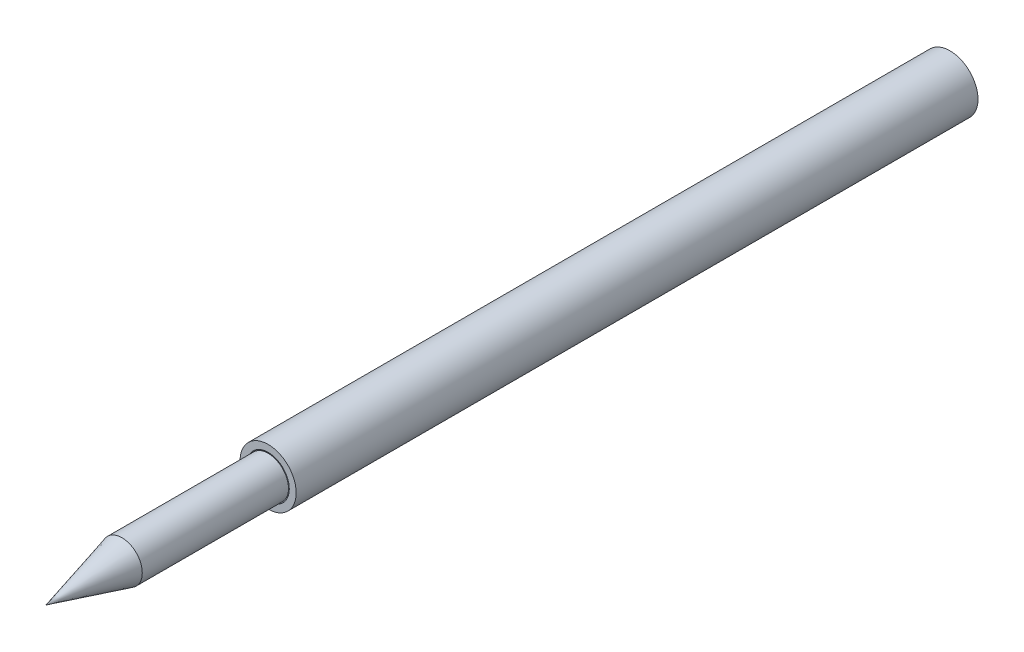
ISO-10303-21;
HEADER;
FILE_DESCRIPTION(('STEP AP214'),'2;1');
FILE_NAME('part.step','',(''),(''),'','','');
FILE_SCHEMA(('AUTOMOTIVE_DESIGN { 1 0 10303 214 1 1 1 1 }'));
ENDSEC;
DATA;
#1=APPLICATION_CONTEXT('core data for automotive mechanical design processes');
#2=APPLICATION_PROTOCOL_DEFINITION('international standard','automotive_design',2000,#1);
#3=PRODUCT_CONTEXT('',#1,'mechanical');
#4=PRODUCT('Part','Part','',(#3));
#5=PRODUCT_RELATED_PRODUCT_CATEGORY('part','',(#4));
#6=PRODUCT_DEFINITION_FORMATION('','',#4);
#7=PRODUCT_DEFINITION_CONTEXT('part definition',#1,'design');
#8=PRODUCT_DEFINITION('design','',#6,#7);
#9=PRODUCT_DEFINITION_SHAPE('','',#8);
#10=(LENGTH_UNIT() NAMED_UNIT(*) SI_UNIT(.MILLI.,.METRE.));
#11=(NAMED_UNIT(*) PLANE_ANGLE_UNIT() SI_UNIT($,.RADIAN.));
#12=(NAMED_UNIT(*) SI_UNIT($,.STERADIAN.) SOLID_ANGLE_UNIT());
#13=UNCERTAINTY_MEASURE_WITH_UNIT(LENGTH_MEASURE(1.E-05),#10,'distance_accuracy_value','');
#14=(GEOMETRIC_REPRESENTATION_CONTEXT(3) GLOBAL_UNCERTAINTY_ASSIGNED_CONTEXT((#13)) GLOBAL_UNIT_ASSIGNED_CONTEXT((#10,
#11,#12)) REPRESENTATION_CONTEXT('',''));
#15=CARTESIAN_POINT('',(0.,0.,0.));
#16=DIRECTION('',(0.,0.,1.));
#17=DIRECTION('',(1.,0.,0.));
#18=AXIS2_PLACEMENT_3D('',#15,#16,#17);
#19=CARTESIAN_POINT('',(-0.0292577713322146,0.,-15.0402853662058));
#20=DIRECTION('',(0.,-1.,0.));
#21=DIRECTION('',(1.,0.,0.));
#22=AXIS2_PLACEMENT_3D('',#19,#20,#21);
#23=CIRCLE('',#22,1.5);
#24=TRIMMED_CURVE('',#23,(PARAMETER_VALUE(-1.55128990889718)),
(PARAMETER_VALUE(1.55128990889718)),.T.,.PARAMETER.);
#25=CARTESIAN_POINT('',(0.,0.,-15.0402853662058));
#26=DIRECTION('',(0.,0.,1.));
#27=AXIS1_PLACEMENT('',#25,#26);
#28=SURFACE_OF_REVOLUTION('',#24,#27);
#29=CARTESIAN_POINT('',(0.,0.,-16.54));
#30=VERTEX_POINT('',#29);
#31=VERTEX_LOOP('',#30);
#32=FACE_BOUND('',#31,.T.);
#33=CARTESIAN_POINT('',(0.,0.,-16.44));
#34=DIRECTION('',(0.,0.,1.));
#35=DIRECTION('',(1.,0.,0.));
#36=AXIS2_PLACEMENT_3D('',#33,#34,#35);
#37=CIRCLE('',#36,0.51);
#38=CARTESIAN_POINT('',(0.51,0.,-16.44));
#39=VERTEX_POINT('',#38);
#40=EDGE_CURVE('P0_E26',#39,#39,#37,.T.);
#41=ORIENTED_EDGE('',*,*,#40,.F.);
#42=EDGE_LOOP('',(#41));
#43=FACE_BOUND('',#42,.T.);
#44=ADVANCED_FACE('P0_F17',(#32,#43),#28,.T.);
#45=CARTESIAN_POINT('',(0.,0.,0.));
#46=DIRECTION('',(0.,0.,1.));
#47=DIRECTION('',(1.,0.,0.));
#48=AXIS2_PLACEMENT_3D('',#45,#46,#47);
#49=CYLINDRICAL_SURFACE('',#48,0.51);
#50=ORIENTED_EDGE('',*,*,#40,.T.);
#51=EDGE_LOOP('',(#50));
#52=FACE_BOUND('',#51,.T.);
#53=CARTESIAN_POINT('',(0.,0.,-4.04));
#54=DIRECTION('',(0.,0.,1.));
#55=DIRECTION('',(1.,0.,0.));
#56=AXIS2_PLACEMENT_3D('',#53,#54,#55);
#57=CIRCLE('',#56,0.51);
#58=CARTESIAN_POINT('',(0.51,0.,-4.04));
#59=VERTEX_POINT('',#58);
#60=EDGE_CURVE('P0_E11',#59,#59,#57,.T.);
#61=ORIENTED_EDGE('',*,*,#60,.F.);
#62=EDGE_LOOP('',(#61));
#63=FACE_BOUND('',#62,.T.);
#64=ADVANCED_FACE('P0_F55',(#52,#63),#49,.T.);
#65=CARTESIAN_POINT('',(0.,0.,-4.04));
#66=DIRECTION('',(0.,0.,1.));
#67=DIRECTION('',(1.,0.,0.));
#68=AXIS2_PLACEMENT_3D('',#65,#66,#67);
#69=PLANE('',#68);
#70=CARTESIAN_POINT('',(0.,0.,-4.04));
#71=DIRECTION('',(0.,0.,1.));
#72=DIRECTION('',(1.,0.,0.));
#73=AXIS2_PLACEMENT_3D('',#70,#71,#72);
#74=CIRCLE('',#73,0.385);
#75=CARTESIAN_POINT('',(0.385,0.,-4.04));
#76=VERTEX_POINT('',#75);
#77=EDGE_CURVE('P0_E42',#76,#76,#74,.T.);
#78=ORIENTED_EDGE('',*,*,#77,.F.);
#79=EDGE_LOOP('',(#78));
#80=FACE_BOUND('',#79,.T.);
#81=ORIENTED_EDGE('',*,*,#60,.T.);
#82=EDGE_LOOP('',(#81));
#83=FACE_BOUND('',#82,.T.);
#84=ADVANCED_FACE('P0_F19',(#80,#83),#69,.T.);
#85=CARTESIAN_POINT('',(-0.0292577713322146,0.,-15.0402853662058));
#86=DIRECTION('',(0.,-1.,0.));
#87=DIRECTION('',(1.,0.,0.));
#88=AXIS2_PLACEMENT_3D('',#85,#86,#87);
#89=CIRCLE('',#88,1.375);
#90=TRIMMED_CURVE('',#89,(PARAMETER_VALUE(-1.54951634161706)),
(PARAMETER_VALUE(1.54951634161706)),.T.,.PARAMETER.);
#91=CARTESIAN_POINT('',(0.,0.,-15.0402853662058));
#92=DIRECTION('',(0.,0.,1.));
#93=AXIS1_PLACEMENT('',#91,#92);
#94=SURFACE_OF_REVOLUTION('',#90,#93);
#95=CARTESIAN_POINT('',(0.,0.,-16.4149740519876));
#96=VERTEX_POINT('',#95);
#97=VERTEX_LOOP('',#96);
#98=FACE_BOUND('',#97,.T.);
#99=CARTESIAN_POINT('',(0.,0.,-16.3513976798123));
#100=DIRECTION('',(0.,0.,1.));
#101=DIRECTION('',(1.,0.,0.));
#102=AXIS2_PLACEMENT_3D('',#99,#100,#101);
#103=CIRCLE('',#102,0.385);
#104=CARTESIAN_POINT('',(0.385,0.,-16.3513976798123));
#105=VERTEX_POINT('',#104);
#106=EDGE_CURVE('P0_E39',#105,#105,#103,.T.);
#107=ORIENTED_EDGE('',*,*,#106,.T.);
#108=EDGE_LOOP('',(#107));
#109=FACE_BOUND('',#108,.T.);
#110=ADVANCED_FACE('P0_F32',(#98,#109),#94,.F.);
#111=CARTESIAN_POINT('',(0.,0.,0.));
#112=DIRECTION('',(0.,0.,1.));
#113=DIRECTION('',(1.,0.,0.));
#114=AXIS2_PLACEMENT_3D('',#111,#112,#113);
#115=CYLINDRICAL_SURFACE('',#114,0.385);
#116=ORIENTED_EDGE('',*,*,#106,.F.);
#117=EDGE_LOOP('',(#116));
#118=FACE_BOUND('',#117,.T.);
#119=ORIENTED_EDGE('',*,*,#77,.T.);
#120=EDGE_LOOP('',(#119));
#121=FACE_BOUND('',#120,.T.);
#122=ADVANCED_FACE('P0_F35',(#118,#121),#115,.F.);
#123=CLOSED_SHELL('',(#44,#64,#84,#110,#122));
#124=MANIFOLD_SOLID_BREP('P0_B1',#123);
#125=CARTESIAN_POINT('',(-0.37,0.,-4.04));
#126=DIRECTION('',(0.,0.,-1.));
#127=DIRECTION('',(-1.,0.,0.));
#128=AXIS2_PLACEMENT_3D('',#125,#126,#127);
#129=PLANE('',#128);
#130=CARTESIAN_POINT('',(0.,0.,-4.04));
#131=DIRECTION('',(0.,0.,1.));
#132=DIRECTION('',(1.,0.,0.));
#133=AXIS2_PLACEMENT_3D('',#130,#131,#132);
#134=CIRCLE('',#133,0.37);
#135=CARTESIAN_POINT('',(0.37,0.,-4.04));
#136=VERTEX_POINT('',#135);
#137=EDGE_CURVE('P1_E24',#136,#136,#134,.T.);
#138=ORIENTED_EDGE('',*,*,#137,.F.);
#139=EDGE_LOOP('',(#138));
#140=FACE_BOUND('',#139,.T.);
#141=ADVANCED_FACE('P1_F16',(#140),#129,.T.);
#142=CARTESIAN_POINT('',(0.,0.,0.));
#143=DIRECTION('',(0.,0.,1.));
#144=DIRECTION('',(1.,0.,0.));
#145=AXIS2_PLACEMENT_3D('',#142,#143,#144);
#146=CYLINDRICAL_SURFACE('',#145,0.37);
#147=ORIENTED_EDGE('',*,*,#137,.T.);
#148=EDGE_LOOP('',(#147));
#149=FACE_BOUND('',#148,.T.);
#150=CARTESIAN_POINT('',(0.,0.,-1.38085879880048));
#151=DIRECTION('',(0.,0.,1.));
#152=DIRECTION('',(1.,0.,0.));
#153=AXIS2_PLACEMENT_3D('',#150,#151,#152);
#154=CIRCLE('',#153,0.37);
#155=CARTESIAN_POINT('',(0.37,0.,-1.38085879880048));
#156=VERTEX_POINT('',#155);
#157=EDGE_CURVE('P1_E10',#156,#156,#154,.T.);
#158=ORIENTED_EDGE('',*,*,#157,.F.);
#159=EDGE_LOOP('',(#158));
#160=FACE_BOUND('',#159,.T.);
#161=ADVANCED_FACE('P1_F28',(#149,#160),#146,.T.);
#162=CARTESIAN_POINT('',(0.,0.,0.));
#163=DIRECTION('',(0.,0.,-1.));
#164=DIRECTION('',(-1.,0.,0.));
#165=AXIS2_PLACEMENT_3D('',#162,#163,#164);
#166=CONICAL_SURFACE('',#165,0.,0.26179938779915);
#167=ORIENTED_EDGE('',*,*,#157,.T.);
#168=EDGE_LOOP('',(#167));
#169=FACE_BOUND('',#168,.T.);
#170=CARTESIAN_POINT('',(0.,0.,0.));
#171=VERTEX_POINT('',#170);
#172=VERTEX_LOOP('',#171);
#173=FACE_BOUND('',#172,.T.);
#174=ADVANCED_FACE('P1_F18',(#169,#173),#166,.T.);
#175=CLOSED_SHELL('',(#141,#161,#174));
#176=MANIFOLD_SOLID_BREP('P1_B1',#175);
#177=ADVANCED_BREP_SHAPE_REPRESENTATION('',(#18,#124,#176),#14);
#178=SHAPE_DEFINITION_REPRESENTATION(#9,#177);
ENDSEC;
END-ISO-10303-21;
